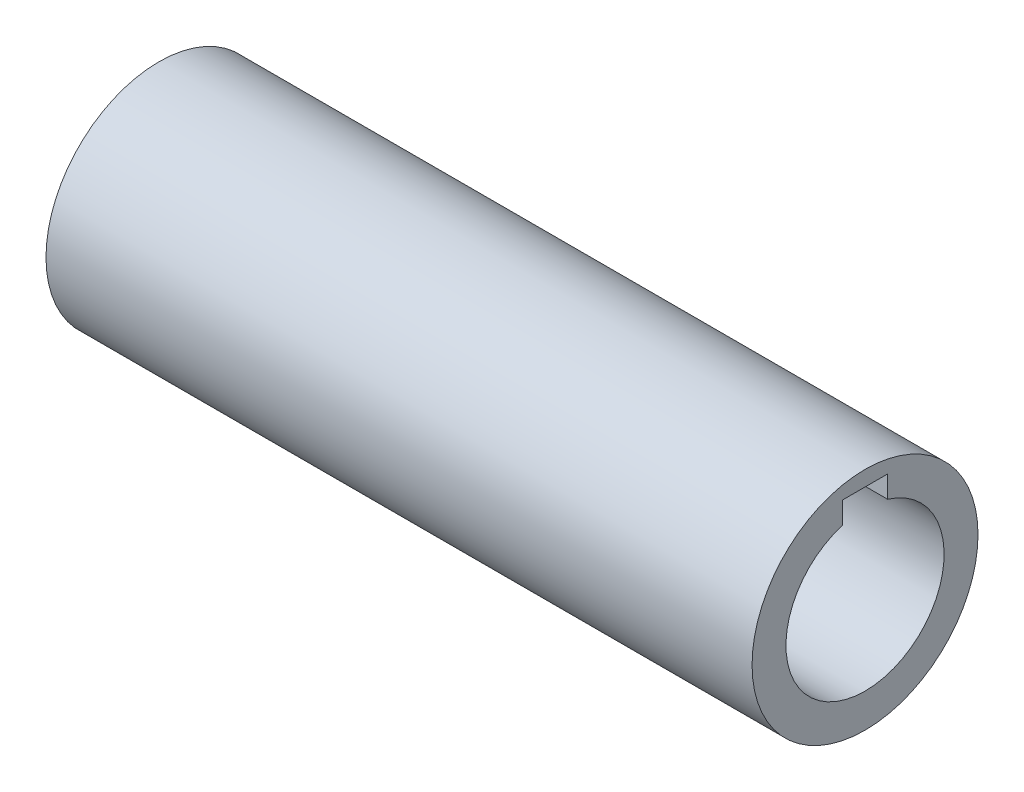
ISO-10303-21;
HEADER;
FILE_DESCRIPTION(('STEP AP214'),'2;1');
FILE_NAME('part.step','',(''),(''),'','','');
FILE_SCHEMA(('AUTOMOTIVE_DESIGN { 1 0 10303 214 1 1 1 1 }'));
ENDSEC;
DATA;
#1=APPLICATION_CONTEXT('core data for automotive mechanical design processes');
#2=APPLICATION_PROTOCOL_DEFINITION('international standard','automotive_design',2000,#1);
#3=PRODUCT_CONTEXT('',#1,'mechanical');
#4=PRODUCT('Part','Part','',(#3));
#5=PRODUCT_RELATED_PRODUCT_CATEGORY('part','',(#4));
#6=PRODUCT_DEFINITION_FORMATION('','',#4);
#7=PRODUCT_DEFINITION_CONTEXT('part definition',#1,'design');
#8=PRODUCT_DEFINITION('design','',#6,#7);
#9=PRODUCT_DEFINITION_SHAPE('','',#8);
#10=(LENGTH_UNIT() NAMED_UNIT(*) SI_UNIT(.MILLI.,.METRE.));
#11=(NAMED_UNIT(*) PLANE_ANGLE_UNIT() SI_UNIT($,.RADIAN.));
#12=(NAMED_UNIT(*) SI_UNIT($,.STERADIAN.) SOLID_ANGLE_UNIT());
#13=UNCERTAINTY_MEASURE_WITH_UNIT(LENGTH_MEASURE(1.E-05),#10,'distance_accuracy_value','');
#14=(GEOMETRIC_REPRESENTATION_CONTEXT(3) GLOBAL_UNCERTAINTY_ASSIGNED_CONTEXT((#13)) GLOBAL_UNIT_ASSIGNED_CONTEXT((#10,
#11,#12)) REPRESENTATION_CONTEXT('',''));
#15=CARTESIAN_POINT('',(0.,0.,0.));
#16=DIRECTION('',(0.,0.,1.));
#17=DIRECTION('',(1.,0.,0.));
#18=AXIS2_PLACEMENT_3D('',#15,#16,#17);
#19=CARTESIAN_POINT('',(105.000000000001,14.,4.44089209850063E-13));
#20=DIRECTION('',(1.,0.,0.));
#21=DIRECTION('',(0.,0.,-1.));
#22=AXIS2_PLACEMENT_3D('',#19,#20,#21);
#23=PLANE('',#22);
#24=DIRECTION('',(0.,1.,0.));
#25=VECTOR('',#24,1.);
#26=CARTESIAN_POINT('',(105.,17.3,4.00000000000045));
#27=LINE('',#26,#25);
#28=CARTESIAN_POINT('',(105.,13.9373598647664,4.00000000000045));
#29=VERTEX_POINT('',#28);
#30=CARTESIAN_POINT('',(105.,13.4164078649987,4.00000000000045));
#31=VERTEX_POINT('',#30);
#32=EDGE_CURVE('E112',#29,#31,#27,.F.);
#33=ORIENTED_EDGE('',*,*,#32,.T.);
#34=CARTESIAN_POINT('',(105.000000000001,0.,4.44089209850063E-13));
#35=DIRECTION('',(-1.,0.,0.));
#36=DIRECTION('',(0.,0.,1.));
#37=AXIS2_PLACEMENT_3D('',#34,#35,#36);
#38=CIRCLE('',#37,14.);
#39=CARTESIAN_POINT('',(105.000000000001,13.4164078649987,-4.));
#40=VERTEX_POINT('',#39);
#41=EDGE_CURVE('E81',#31,#40,#38,.F.);
#42=ORIENTED_EDGE('',*,*,#41,.T.);
#43=DIRECTION('',(0.,1.,0.));
#44=VECTOR('',#43,1.);
#45=CARTESIAN_POINT('',(105.000000000001,14.,-4.));
#46=LINE('',#45,#44);
#47=CARTESIAN_POINT('',(105.000000000001,13.9373598647664,-4.));
#48=VERTEX_POINT('',#47);
#49=EDGE_CURVE('E77',#48,#40,#46,.F.);
#50=ORIENTED_EDGE('',*,*,#49,.F.);
#51=CARTESIAN_POINT('',(105.000000000001,0.,4.44089209850063E-13));
#52=DIRECTION('',(-1.,0.,0.));
#53=DIRECTION('',(0.,0.,1.));
#54=AXIS2_PLACEMENT_3D('',#51,#52,#53);
#55=CIRCLE('',#54,14.5);
#56=EDGE_CURVE('E28',#48,#29,#55,.T.);
#57=ORIENTED_EDGE('',*,*,#56,.T.);
#58=EDGE_LOOP('',(#33,#42,#50,#57));
#59=FACE_BOUND('',#58,.T.);
#60=ADVANCED_FACE('F25',(#59),#23,.F.);
#61=CARTESIAN_POINT('',(125.000000000001,0.,4.44089209850063E-13));
#62=DIRECTION('',(-1.,0.,0.));
#63=DIRECTION('',(0.,0.,1.));
#64=AXIS2_PLACEMENT_3D('',#61,#62,#63);
#65=CYLINDRICAL_SURFACE('',#64,14.5);
#66=DIRECTION('',(1.,0.,0.));
#67=VECTOR('',#66,1.);
#68=CARTESIAN_POINT('',(67.0000000000003,13.9373598647664,4.));
#69=LINE('',#68,#67);
#70=CARTESIAN_POINT('',(67.0000000000003,13.9373598647664,4.));
#71=VERTEX_POINT('',#70);
#72=EDGE_CURVE('E91',#71,#29,#69,.T.);
#73=ORIENTED_EDGE('',*,*,#72,.T.);
#74=ORIENTED_EDGE('',*,*,#56,.F.);
#75=DIRECTION('',(-1.,0.,0.));
#76=VECTOR('',#75,1.);
#77=CARTESIAN_POINT('',(67.0000000000007,13.9373598647664,-4.));
#78=LINE('',#77,#76);
#79=CARTESIAN_POINT('',(67.0000000000007,13.9373598647664,-4.));
#80=VERTEX_POINT('',#79);
#81=EDGE_CURVE('E88',#48,#80,#78,.T.);
#82=ORIENTED_EDGE('',*,*,#81,.T.);
#83=CARTESIAN_POINT('',(67.0000000000007,0.,8.88178419700125E-13));
#84=DIRECTION('',(-1.,0.,0.));
#85=DIRECTION('',(0.,0.,1.));
#86=AXIS2_PLACEMENT_3D('',#83,#84,#85);
#87=CIRCLE('',#86,14.5);
#88=EDGE_CURVE('E94',#80,#71,#87,.T.);
#89=ORIENTED_EDGE('',*,*,#88,.T.);
#90=EDGE_LOOP('',(#73,#74,#82,#89));
#91=FACE_BOUND('',#90,.T.);
#92=ADVANCED_FACE('F87',(#91),#65,.F.);
#93=CARTESIAN_POINT('',(67.0000000000007,14.5,8.88178419700125E-13));
#94=DIRECTION('',(-1.,0.,0.));
#95=DIRECTION('',(0.,0.,1.));
#96=AXIS2_PLACEMENT_3D('',#93,#94,#95);
#97=PLANE('',#96);
#98=ORIENTED_EDGE('',*,*,#88,.F.);
#99=DIRECTION('',(0.,1.,0.));
#100=VECTOR('',#99,1.);
#101=CARTESIAN_POINT('',(67.0000000000007,3.3,-4.));
#102=LINE('',#101,#100);
#103=CARTESIAN_POINT('',(67.0000000000007,17.3,-4.));
#104=VERTEX_POINT('',#103);
#105=EDGE_CURVE('E97',#80,#104,#102,.T.);
#106=ORIENTED_EDGE('',*,*,#105,.T.);
#107=DIRECTION('',(0.,0.,1.));
#108=VECTOR('',#107,1.);
#109=CARTESIAN_POINT('',(67.0000000000007,17.3,-4.));
#110=LINE('',#109,#108);
#111=CARTESIAN_POINT('',(67.0000000000003,17.3,4.));
#112=VERTEX_POINT('',#111);
#113=EDGE_CURVE('E105',#104,#112,#110,.T.);
#114=ORIENTED_EDGE('',*,*,#113,.T.);
#115=DIRECTION('',(0.,1.,0.));
#116=VECTOR('',#115,1.);
#117=CARTESIAN_POINT('',(67.0000000000003,17.3,4.));
#118=LINE('',#117,#116);
#119=EDGE_CURVE('E117',#112,#71,#118,.F.);
#120=ORIENTED_EDGE('',*,*,#119,.T.);
#121=EDGE_LOOP('',(#98,#106,#114,#120));
#122=FACE_BOUND('',#121,.T.);
#123=ADVANCED_FACE('F194',(#122),#97,.F.);
#124=CARTESIAN_POINT('',(67.0000000000003,17.3,4.));
#125=DIRECTION('',(0.,0.,1.));
#126=DIRECTION('',(1.,0.,0.));
#127=AXIS2_PLACEMENT_3D('',#124,#125,#126);
#128=PLANE('',#127);
#129=ORIENTED_EDGE('',*,*,#72,.F.);
#130=ORIENTED_EDGE('',*,*,#119,.F.);
#131=DIRECTION('',(1.,0.,0.));
#132=VECTOR('',#131,1.);
#133=CARTESIAN_POINT('',(67.0000000000003,17.3,4.));
#134=LINE('',#133,#132);
#135=CARTESIAN_POINT('',(125.000000000001,17.3,4.00000000000089));
#136=VERTEX_POINT('',#135);
#137=EDGE_CURVE('E140',#112,#136,#134,.T.);
#138=ORIENTED_EDGE('',*,*,#137,.T.);
#139=DIRECTION('',(0.,1.,0.));
#140=VECTOR('',#139,1.);
#141=CARTESIAN_POINT('',(125.000000000001,20.,4.00000000000089));
#142=LINE('',#141,#140);
#143=CARTESIAN_POINT('',(125.000000000001,13.4164078649987,4.00000000000089));
#144=VERTEX_POINT('',#143);
#145=EDGE_CURVE('E126',#136,#144,#142,.F.);
#146=ORIENTED_EDGE('',*,*,#145,.T.);
#147=DIRECTION('',(-1.,0.,0.));
#148=VECTOR('',#147,1.);
#149=CARTESIAN_POINT('',(125.000000000001,13.4164078649987,4.00000000000089));
#150=LINE('',#149,#148);
#151=EDGE_CURVE('E115',#144,#31,#150,.T.);
#152=ORIENTED_EDGE('',*,*,#151,.T.);
#153=ORIENTED_EDGE('',*,*,#32,.F.);
#154=EDGE_LOOP('',(#129,#130,#138,#146,#152,#153));
#155=FACE_BOUND('',#154,.T.);
#156=ADVANCED_FACE('F182',(#155),#128,.F.);
#157=CARTESIAN_POINT('',(125.000000000001,0.,4.44089209850063E-13));
#158=DIRECTION('',(-1.,0.,0.));
#159=DIRECTION('',(0.,0.,1.));
#160=AXIS2_PLACEMENT_3D('',#157,#158,#159);
#161=CYLINDRICAL_SURFACE('',#160,14.);
#162=ORIENTED_EDGE('',*,*,#151,.F.);
#163=CARTESIAN_POINT('',(125.000000000001,0.,4.44089209850063E-13));
#164=DIRECTION('',(-1.,0.,0.));
#165=DIRECTION('',(0.,0.,1.));
#166=AXIS2_PLACEMENT_3D('',#163,#164,#165);
#167=CIRCLE('',#166,14.);
#168=CARTESIAN_POINT('',(125.000000000001,13.4164078649987,-4.));
#169=VERTEX_POINT('',#168);
#170=EDGE_CURVE('E123',#144,#169,#167,.F.);
#171=ORIENTED_EDGE('',*,*,#170,.T.);
#172=DIRECTION('',(-1.,0.,0.));
#173=VECTOR('',#172,1.);
#174=CARTESIAN_POINT('',(67.0000000000007,13.4164078649987,-4.));
#175=LINE('',#174,#173);
#176=EDGE_CURVE('E99',#169,#40,#175,.T.);
#177=ORIENTED_EDGE('',*,*,#176,.T.);
#178=ORIENTED_EDGE('',*,*,#41,.F.);
#179=EDGE_LOOP('',(#162,#171,#177,#178));
#180=FACE_BOUND('',#179,.T.);
#181=ADVANCED_FACE('F188',(#180),#161,.F.);
#182=CARTESIAN_POINT('',(67.0000000000007,3.3,-4.));
#183=DIRECTION('',(0.,0.,-1.));
#184=DIRECTION('',(-1.,0.,0.));
#185=AXIS2_PLACEMENT_3D('',#182,#183,#184);
#186=PLANE('',#185);
#187=DIRECTION('',(1.,0.,0.));
#188=VECTOR('',#187,1.);
#189=CARTESIAN_POINT('',(67.0000000000007,17.3,-4.));
#190=LINE('',#189,#188);
#191=CARTESIAN_POINT('',(125.000000000001,17.3,-4.));
#192=VERTEX_POINT('',#191);
#193=EDGE_CURVE('E147',#192,#104,#190,.F.);
#194=ORIENTED_EDGE('',*,*,#193,.T.);
#195=ORIENTED_EDGE('',*,*,#105,.F.);
#196=ORIENTED_EDGE('',*,*,#81,.F.);
#197=ORIENTED_EDGE('',*,*,#49,.T.);
#198=ORIENTED_EDGE('',*,*,#176,.F.);
#199=DIRECTION('',(0.,1.,0.));
#200=VECTOR('',#199,1.);
#201=CARTESIAN_POINT('',(125.000000000001,20.,-4.));
#202=LINE('',#201,#200);
#203=EDGE_CURVE('E44',#169,#192,#202,.T.);
#204=ORIENTED_EDGE('',*,*,#203,.T.);
#205=EDGE_LOOP('',(#194,#195,#196,#197,#198,#204));
#206=FACE_BOUND('',#205,.T.);
#207=ADVANCED_FACE('F96',(#206),#186,.F.);
#208=CARTESIAN_POINT('',(67.0000000000007,17.3,-4.));
#209=DIRECTION('',(0.,1.,0.));
#210=DIRECTION('',(0.,0.,1.));
#211=AXIS2_PLACEMENT_3D('',#208,#209,#210);
#212=PLANE('',#211);
#213=DIRECTION('',(0.,0.,1.));
#214=VECTOR('',#213,1.);
#215=CARTESIAN_POINT('',(125.000000000001,17.3,4.44089209850063E-13));
#216=LINE('',#215,#214);
#217=EDGE_CURVE('E122',#192,#136,#216,.T.);
#218=ORIENTED_EDGE('',*,*,#217,.T.);
#219=ORIENTED_EDGE('',*,*,#137,.F.);
#220=ORIENTED_EDGE('',*,*,#113,.F.);
#221=ORIENTED_EDGE('',*,*,#193,.F.);
#222=EDGE_LOOP('',(#218,#219,#220,#221));
#223=FACE_BOUND('',#222,.T.);
#224=ADVANCED_FACE('F192',(#223),#212,.F.);
#225=CARTESIAN_POINT('',(125.000000000001,20.,4.44089209850063E-13));
#226=DIRECTION('',(-1.,0.,0.));
#227=DIRECTION('',(0.,0.,1.));
#228=AXIS2_PLACEMENT_3D('',#225,#226,#227);
#229=PLANE('',#228);
#230=ORIENTED_EDGE('',*,*,#203,.F.);
#231=ORIENTED_EDGE('',*,*,#170,.F.);
#232=ORIENTED_EDGE('',*,*,#145,.F.);
#233=ORIENTED_EDGE('',*,*,#217,.F.);
#234=EDGE_LOOP('',(#230,#231,#232,#233));
#235=FACE_BOUND('',#234,.T.);
#236=CARTESIAN_POINT('',(125.000000000001,0.,4.44089209850063E-13));
#237=DIRECTION('',(-1.,0.,0.));
#238=DIRECTION('',(0.,0.,1.));
#239=AXIS2_PLACEMENT_3D('',#236,#237,#238);
#240=CIRCLE('',#239,20.);
#241=CARTESIAN_POINT('',(125.000000000001,0.,20.0000000000005));
#242=VERTEX_POINT('',#241);
#243=EDGE_CURVE('E35',#242,#242,#240,.T.);
#244=ORIENTED_EDGE('',*,*,#243,.F.);
#245=EDGE_LOOP('',(#244));
#246=FACE_BOUND('',#245,.T.);
#247=ADVANCED_FACE('F189',(#235,#246),#229,.F.);
#248=CARTESIAN_POINT('',(0.,0.,0.));
#249=DIRECTION('',(1.,0.,0.));
#250=DIRECTION('',(0.,0.,-1.));
#251=AXIS2_PLACEMENT_3D('',#248,#249,#250);
#252=PLANE('',#251);
#253=CARTESIAN_POINT('',(0.,0.,0.));
#254=DIRECTION('',(-1.,0.,0.));
#255=DIRECTION('',(0.,0.,1.));
#256=AXIS2_PLACEMENT_3D('',#253,#254,#255);
#257=CIRCLE('',#256,20.);
#258=CARTESIAN_POINT('',(0.,0.,20.));
#259=VERTEX_POINT('',#258);
#260=EDGE_CURVE('E13',#259,#259,#257,.F.);
#261=ORIENTED_EDGE('',*,*,#260,.F.);
#262=EDGE_LOOP('',(#261));
#263=FACE_BOUND('',#262,.T.);
#264=ADVANCED_FACE('F205',(#263),#252,.F.);
#265=CARTESIAN_POINT('',(125.000000000001,0.,4.44089209850063E-13));
#266=DIRECTION('',(-1.,0.,0.));
#267=DIRECTION('',(0.,0.,1.));
#268=AXIS2_PLACEMENT_3D('',#265,#266,#267);
#269=CYLINDRICAL_SURFACE('',#268,20.);
#270=ORIENTED_EDGE('',*,*,#260,.T.);
#271=EDGE_LOOP('',(#270));
#272=FACE_BOUND('',#271,.T.);
#273=ORIENTED_EDGE('',*,*,#243,.T.);
#274=EDGE_LOOP('',(#273));
#275=FACE_BOUND('',#274,.T.);
#276=ADVANCED_FACE('F203',(#272,#275),#269,.T.);
#277=CLOSED_SHELL('',(#60,#92,#123,#156,#181,#207,#224,#247,#264,#276));
#278=MANIFOLD_SOLID_BREP('B1',#277);
#279=ADVANCED_BREP_SHAPE_REPRESENTATION('',(#18,#278),#14);
#280=SHAPE_DEFINITION_REPRESENTATION(#9,#279);
ENDSEC;
END-ISO-10303-21;
